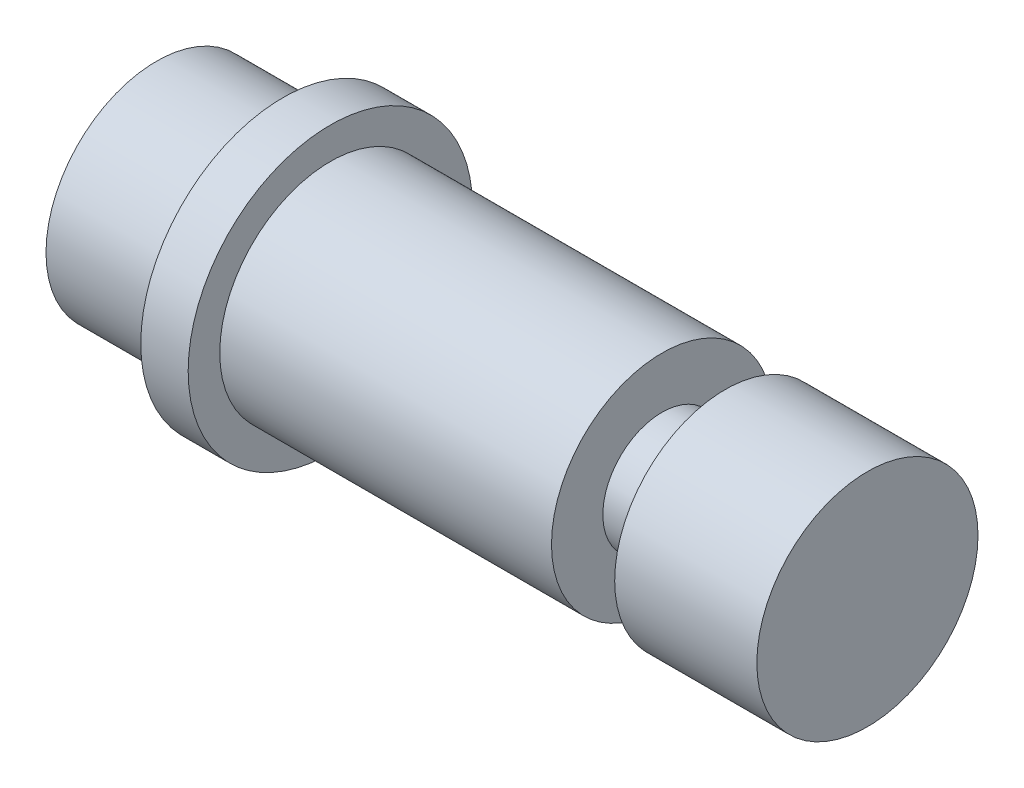
ISO-10303-21;
HEADER;
FILE_DESCRIPTION(('STEP AP214'),'2;1');
FILE_NAME('part.step','',(''),(''),'','','');
FILE_SCHEMA(('AUTOMOTIVE_DESIGN { 1 0 10303 214 1 1 1 1 }'));
ENDSEC;
DATA;
#1=APPLICATION_CONTEXT('core data for automotive mechanical design processes');
#2=APPLICATION_PROTOCOL_DEFINITION('international standard','automotive_design',2000,#1);
#3=PRODUCT_CONTEXT('',#1,'mechanical');
#4=PRODUCT('Part','Part','',(#3));
#5=PRODUCT_RELATED_PRODUCT_CATEGORY('part','',(#4));
#6=PRODUCT_DEFINITION_FORMATION('','',#4);
#7=PRODUCT_DEFINITION_CONTEXT('part definition',#1,'design');
#8=PRODUCT_DEFINITION('design','',#6,#7);
#9=PRODUCT_DEFINITION_SHAPE('','',#8);
#10=(LENGTH_UNIT() NAMED_UNIT(*) SI_UNIT(.MILLI.,.METRE.));
#11=(NAMED_UNIT(*) PLANE_ANGLE_UNIT() SI_UNIT($,.RADIAN.));
#12=(NAMED_UNIT(*) SI_UNIT($,.STERADIAN.) SOLID_ANGLE_UNIT());
#13=UNCERTAINTY_MEASURE_WITH_UNIT(LENGTH_MEASURE(1.E-05),#10,'distance_accuracy_value','');
#14=(GEOMETRIC_REPRESENTATION_CONTEXT(3) GLOBAL_UNCERTAINTY_ASSIGNED_CONTEXT((#13)) GLOBAL_UNIT_ASSIGNED_CONTEXT((#10,
#11,#12)) REPRESENTATION_CONTEXT('',''));
#15=CARTESIAN_POINT('',(0.,0.,0.));
#16=DIRECTION('',(0.,0.,1.));
#17=DIRECTION('',(1.,0.,0.));
#18=AXIS2_PLACEMENT_3D('',#15,#16,#17);
#19=CARTESIAN_POINT('',(0.,0.,0.));
#20=DIRECTION('',(1.,0.,0.));
#21=DIRECTION('',(0.,0.,-1.));
#22=AXIS2_PLACEMENT_3D('',#19,#20,#21);
#23=CYLINDRICAL_SURFACE('',#22,7.);
#24=CARTESIAN_POINT('',(0.,0.,0.));
#25=DIRECTION('',(1.,0.,0.));
#26=DIRECTION('',(0.,0.,-1.));
#27=AXIS2_PLACEMENT_3D('',#24,#25,#26);
#28=CIRCLE('',#27,7.);
#29=CARTESIAN_POINT('',(0.,0.,-7.));
#30=VERTEX_POINT('',#29);
#31=EDGE_CURVE('E10',#30,#30,#28,.T.);
#32=ORIENTED_EDGE('',*,*,#31,.T.);
#33=EDGE_LOOP('',(#32));
#34=FACE_BOUND('',#33,.T.);
#35=CARTESIAN_POINT('',(8.,0.,0.));
#36=DIRECTION('',(1.,0.,0.));
#37=DIRECTION('',(0.,0.,-1.));
#38=AXIS2_PLACEMENT_3D('',#35,#36,#37);
#39=CIRCLE('',#38,7.);
#40=CARTESIAN_POINT('',(8.,0.,-7.));
#41=VERTEX_POINT('',#40);
#42=EDGE_CURVE('E67',#41,#41,#39,.T.);
#43=ORIENTED_EDGE('',*,*,#42,.F.);
#44=EDGE_LOOP('',(#43));
#45=FACE_BOUND('',#44,.T.);
#46=ADVANCED_FACE('F33',(#34,#45),#23,.T.);
#47=CARTESIAN_POINT('',(0.,0.,0.));
#48=DIRECTION('',(-1.,0.,0.));
#49=DIRECTION('',(0.,0.,1.));
#50=AXIS2_PLACEMENT_3D('',#47,#48,#49);
#51=PLANE('',#50);
#52=ORIENTED_EDGE('',*,*,#31,.F.);
#53=EDGE_LOOP('',(#52));
#54=FACE_BOUND('',#53,.T.);
#55=ADVANCED_FACE('F75',(#54),#51,.T.);
#56=CARTESIAN_POINT('',(45.,0.,0.));
#57=DIRECTION('',(1.,0.,0.));
#58=DIRECTION('',(0.,0.,-1.));
#59=AXIS2_PLACEMENT_3D('',#56,#57,#58);
#60=PLANE('',#59);
#61=CARTESIAN_POINT('',(45.,0.,0.));
#62=DIRECTION('',(1.,0.,0.));
#63=DIRECTION('',(0.,0.,-1.));
#64=AXIS2_PLACEMENT_3D('',#61,#62,#63);
#65=CIRCLE('',#64,7.);
#66=CARTESIAN_POINT('',(45.,0.,-7.));
#67=VERTEX_POINT('',#66);
#68=EDGE_CURVE('E39',#67,#67,#65,.T.);
#69=ORIENTED_EDGE('',*,*,#68,.T.);
#70=EDGE_LOOP('',(#69));
#71=FACE_BOUND('',#70,.T.);
#72=ADVANCED_FACE('F79',(#71),#60,.T.);
#73=CARTESIAN_POINT('',(0.,0.,0.));
#74=DIRECTION('',(1.,0.,0.));
#75=DIRECTION('',(0.,0.,-1.));
#76=AXIS2_PLACEMENT_3D('',#73,#74,#75);
#77=CYLINDRICAL_SURFACE('',#76,7.);
#78=CARTESIAN_POINT('',(36.,0.,0.));
#79=DIRECTION('',(1.,0.,0.));
#80=DIRECTION('',(0.,0.,-1.));
#81=AXIS2_PLACEMENT_3D('',#78,#79,#80);
#82=CIRCLE('',#81,7.);
#83=CARTESIAN_POINT('',(36.,0.,-7.));
#84=VERTEX_POINT('',#83);
#85=EDGE_CURVE('E43',#84,#84,#82,.T.);
#86=ORIENTED_EDGE('',*,*,#85,.T.);
#87=EDGE_LOOP('',(#86));
#88=FACE_BOUND('',#87,.T.);
#89=ORIENTED_EDGE('',*,*,#68,.F.);
#90=EDGE_LOOP('',(#89));
#91=FACE_BOUND('',#90,.T.);
#92=ADVANCED_FACE('F84',(#88,#91),#77,.T.);
#93=CARTESIAN_POINT('',(36.,0.,0.));
#94=DIRECTION('',(-1.,0.,0.));
#95=DIRECTION('',(0.,0.,1.));
#96=AXIS2_PLACEMENT_3D('',#93,#94,#95);
#97=PLANE('',#96);
#98=CARTESIAN_POINT('',(36.,0.,0.));
#99=DIRECTION('',(1.,0.,0.));
#100=DIRECTION('',(0.,0.,-1.));
#101=AXIS2_PLACEMENT_3D('',#98,#99,#100);
#102=CIRCLE('',#101,3.75);
#103=CARTESIAN_POINT('',(36.,0.,-3.75));
#104=VERTEX_POINT('',#103);
#105=EDGE_CURVE('E47',#104,#104,#102,.T.);
#106=ORIENTED_EDGE('',*,*,#105,.T.);
#107=EDGE_LOOP('',(#106));
#108=FACE_BOUND('',#107,.T.);
#109=ORIENTED_EDGE('',*,*,#85,.F.);
#110=EDGE_LOOP('',(#109));
#111=FACE_BOUND('',#110,.T.);
#112=ADVANCED_FACE('F89',(#108,#111),#97,.T.);
#113=CARTESIAN_POINT('',(0.,0.,0.));
#114=DIRECTION('',(1.,0.,0.));
#115=DIRECTION('',(0.,0.,-1.));
#116=AXIS2_PLACEMENT_3D('',#113,#114,#115);
#117=CYLINDRICAL_SURFACE('',#116,3.75);
#118=CARTESIAN_POINT('',(32.,0.,0.));
#119=DIRECTION('',(1.,0.,0.));
#120=DIRECTION('',(0.,0.,-1.));
#121=AXIS2_PLACEMENT_3D('',#118,#119,#120);
#122=CIRCLE('',#121,3.75);
#123=CARTESIAN_POINT('',(32.,0.,-3.75));
#124=VERTEX_POINT('',#123);
#125=EDGE_CURVE('E52',#124,#124,#122,.T.);
#126=ORIENTED_EDGE('',*,*,#125,.T.);
#127=EDGE_LOOP('',(#126));
#128=FACE_BOUND('',#127,.T.);
#129=ORIENTED_EDGE('',*,*,#105,.F.);
#130=EDGE_LOOP('',(#129));
#131=FACE_BOUND('',#130,.T.);
#132=ADVANCED_FACE('F93',(#128,#131),#117,.T.);
#133=CARTESIAN_POINT('',(32.,0.,0.));
#134=DIRECTION('',(1.,0.,0.));
#135=DIRECTION('',(0.,0.,-1.));
#136=AXIS2_PLACEMENT_3D('',#133,#134,#135);
#137=PLANE('',#136);
#138=CARTESIAN_POINT('',(32.,0.,0.));
#139=DIRECTION('',(1.,0.,0.));
#140=DIRECTION('',(0.,0.,-1.));
#141=AXIS2_PLACEMENT_3D('',#138,#139,#140);
#142=CIRCLE('',#141,7.);
#143=CARTESIAN_POINT('',(32.,0.,-7.));
#144=VERTEX_POINT('',#143);
#145=EDGE_CURVE('E55',#144,#144,#142,.T.);
#146=ORIENTED_EDGE('',*,*,#145,.T.);
#147=EDGE_LOOP('',(#146));
#148=FACE_BOUND('',#147,.T.);
#149=ORIENTED_EDGE('',*,*,#125,.F.);
#150=EDGE_LOOP('',(#149));
#151=FACE_BOUND('',#150,.T.);
#152=ADVANCED_FACE('F97',(#148,#151),#137,.T.);
#153=CARTESIAN_POINT('',(0.,0.,0.));
#154=DIRECTION('',(1.,0.,0.));
#155=DIRECTION('',(0.,0.,-1.));
#156=AXIS2_PLACEMENT_3D('',#153,#154,#155);
#157=CYLINDRICAL_SURFACE('',#156,7.);
#158=CARTESIAN_POINT('',(11.,0.,0.));
#159=DIRECTION('',(1.,0.,0.));
#160=DIRECTION('',(0.,0.,-1.));
#161=AXIS2_PLACEMENT_3D('',#158,#159,#160);
#162=CIRCLE('',#161,7.);
#163=CARTESIAN_POINT('',(11.,0.,-7.));
#164=VERTEX_POINT('',#163);
#165=EDGE_CURVE('E58',#164,#164,#162,.T.);
#166=ORIENTED_EDGE('',*,*,#165,.T.);
#167=EDGE_LOOP('',(#166));
#168=FACE_BOUND('',#167,.T.);
#169=ORIENTED_EDGE('',*,*,#145,.F.);
#170=EDGE_LOOP('',(#169));
#171=FACE_BOUND('',#170,.T.);
#172=ADVANCED_FACE('F101',(#168,#171),#157,.T.);
#173=CARTESIAN_POINT('',(11.,0.,0.));
#174=DIRECTION('',(1.,0.,0.));
#175=DIRECTION('',(0.,0.,-1.));
#176=AXIS2_PLACEMENT_3D('',#173,#174,#175);
#177=PLANE('',#176);
#178=CARTESIAN_POINT('',(11.,0.,0.));
#179=DIRECTION('',(1.,0.,0.));
#180=DIRECTION('',(0.,0.,-1.));
#181=AXIS2_PLACEMENT_3D('',#178,#179,#180);
#182=CIRCLE('',#181,9.);
#183=CARTESIAN_POINT('',(11.,0.,-9.));
#184=VERTEX_POINT('',#183);
#185=EDGE_CURVE('E61',#184,#184,#182,.T.);
#186=ORIENTED_EDGE('',*,*,#185,.T.);
#187=EDGE_LOOP('',(#186));
#188=FACE_BOUND('',#187,.T.);
#189=ORIENTED_EDGE('',*,*,#165,.F.);
#190=EDGE_LOOP('',(#189));
#191=FACE_BOUND('',#190,.T.);
#192=ADVANCED_FACE('F105',(#188,#191),#177,.T.);
#193=CARTESIAN_POINT('',(0.,0.,0.));
#194=DIRECTION('',(1.,0.,0.));
#195=DIRECTION('',(0.,0.,-1.));
#196=AXIS2_PLACEMENT_3D('',#193,#194,#195);
#197=CYLINDRICAL_SURFACE('',#196,9.);
#198=CARTESIAN_POINT('',(8.,0.,0.));
#199=DIRECTION('',(1.,0.,0.));
#200=DIRECTION('',(0.,0.,-1.));
#201=AXIS2_PLACEMENT_3D('',#198,#199,#200);
#202=CIRCLE('',#201,9.);
#203=CARTESIAN_POINT('',(8.,0.,-9.));
#204=VERTEX_POINT('',#203);
#205=EDGE_CURVE('E64',#204,#204,#202,.T.);
#206=ORIENTED_EDGE('',*,*,#205,.T.);
#207=EDGE_LOOP('',(#206));
#208=FACE_BOUND('',#207,.T.);
#209=ORIENTED_EDGE('',*,*,#185,.F.);
#210=EDGE_LOOP('',(#209));
#211=FACE_BOUND('',#210,.T.);
#212=ADVANCED_FACE('F109',(#208,#211),#197,.T.);
#213=CARTESIAN_POINT('',(8.,0.,0.));
#214=DIRECTION('',(-1.,0.,0.));
#215=DIRECTION('',(0.,0.,1.));
#216=AXIS2_PLACEMENT_3D('',#213,#214,#215);
#217=PLANE('',#216);
#218=ORIENTED_EDGE('',*,*,#42,.T.);
#219=EDGE_LOOP('',(#218));
#220=FACE_BOUND('',#219,.T.);
#221=ORIENTED_EDGE('',*,*,#205,.F.);
#222=EDGE_LOOP('',(#221));
#223=FACE_BOUND('',#222,.T.);
#224=ADVANCED_FACE('F71',(#220,#223),#217,.T.);
#225=CLOSED_SHELL('',(#46,#55,#72,#92,#112,#132,#152,#172,#192,#212,#224));
#226=MANIFOLD_SOLID_BREP('B2',#225);
#227=ADVANCED_BREP_SHAPE_REPRESENTATION('',(#18,#226),#14);
#228=SHAPE_DEFINITION_REPRESENTATION(#9,#227);
ENDSEC;
END-ISO-10303-21;
